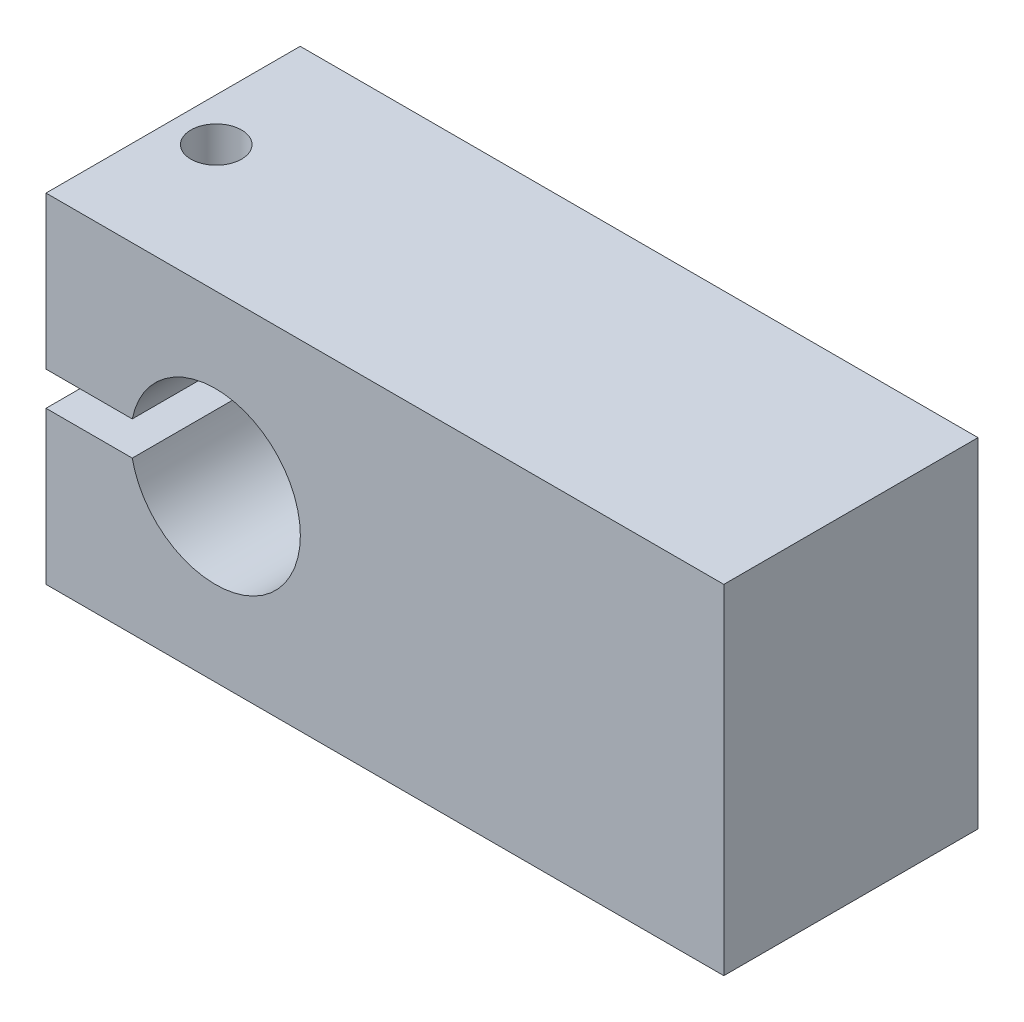
ISO-10303-21;
HEADER;
FILE_DESCRIPTION(('STEP AP214'),'2;1');
FILE_NAME('part.step','',(''),(''),'','','');
FILE_SCHEMA(('AUTOMOTIVE_DESIGN { 1 0 10303 214 1 1 1 1 }'));
ENDSEC;
DATA;
#1=APPLICATION_CONTEXT('core data for automotive mechanical design processes');
#2=APPLICATION_PROTOCOL_DEFINITION('international standard','automotive_design',2000,#1);
#3=PRODUCT_CONTEXT('',#1,'mechanical');
#4=PRODUCT('Part','Part','',(#3));
#5=PRODUCT_RELATED_PRODUCT_CATEGORY('part','',(#4));
#6=PRODUCT_DEFINITION_FORMATION('','',#4);
#7=PRODUCT_DEFINITION_CONTEXT('part definition',#1,'design');
#8=PRODUCT_DEFINITION('design','',#6,#7);
#9=PRODUCT_DEFINITION_SHAPE('','',#8);
#10=(LENGTH_UNIT() NAMED_UNIT(*) SI_UNIT(.MILLI.,.METRE.));
#11=(NAMED_UNIT(*) PLANE_ANGLE_UNIT() SI_UNIT($,.RADIAN.));
#12=(NAMED_UNIT(*) SI_UNIT($,.STERADIAN.) SOLID_ANGLE_UNIT());
#13=UNCERTAINTY_MEASURE_WITH_UNIT(LENGTH_MEASURE(1.E-05),#10,'distance_accuracy_value','');
#14=(GEOMETRIC_REPRESENTATION_CONTEXT(3) GLOBAL_UNCERTAINTY_ASSIGNED_CONTEXT((#13)) GLOBAL_UNIT_ASSIGNED_CONTEXT((#10,
#11,#12)) REPRESENTATION_CONTEXT('',''));
#15=CARTESIAN_POINT('',(0.,0.,0.));
#16=DIRECTION('',(0.,0.,1.));
#17=DIRECTION('',(1.,0.,0.));
#18=AXIS2_PLACEMENT_3D('',#15,#16,#17);
#19=CARTESIAN_POINT('',(0.,0.,19.05));
#20=DIRECTION('',(1.,0.,0.));
#21=DIRECTION('',(0.,0.,-1.));
#22=AXIS2_PLACEMENT_3D('',#19,#20,#21);
#23=PLANE('',#22);
#24=DIRECTION('',(0.,0.,1.));
#25=VECTOR('',#24,1.);
#26=CARTESIAN_POINT('',(0.,11.43,0.));
#27=LINE('',#26,#25);
#28=CARTESIAN_POINT('',(0.,11.43,0.));
#29=VERTEX_POINT('',#28);
#30=CARTESIAN_POINT('',(0.,11.43,19.05));
#31=VERTEX_POINT('',#30);
#32=EDGE_CURVE('E147',#29,#31,#27,.T.);
#33=ORIENTED_EDGE('',*,*,#32,.F.);
#34=DIRECTION('',(0.,-1.,0.));
#35=VECTOR('',#34,1.);
#36=CARTESIAN_POINT('',(0.,0.,0.));
#37=LINE('',#36,#35);
#38=CARTESIAN_POINT('',(0.,0.,0.));
#39=VERTEX_POINT('',#38);
#40=EDGE_CURVE('E146',#29,#39,#37,.T.);
#41=ORIENTED_EDGE('',*,*,#40,.T.);
#42=DIRECTION('',(0.,0.,-1.));
#43=VECTOR('',#42,1.);
#44=CARTESIAN_POINT('',(0.,0.,19.05));
#45=LINE('',#44,#43);
#46=CARTESIAN_POINT('',(0.,0.,19.05));
#47=VERTEX_POINT('',#46);
#48=EDGE_CURVE('E11',#47,#39,#45,.T.);
#49=ORIENTED_EDGE('',*,*,#48,.F.);
#50=DIRECTION('',(0.,-1.,0.));
#51=VECTOR('',#50,1.);
#52=CARTESIAN_POINT('',(0.,0.,19.05));
#53=LINE('',#52,#51);
#54=EDGE_CURVE('E91',#31,#47,#53,.T.);
#55=ORIENTED_EDGE('',*,*,#54,.F.);
#56=EDGE_LOOP('',(#33,#41,#49,#55));
#57=FACE_BOUND('',#56,.T.);
#58=ADVANCED_FACE('F39',(#57),#23,.F.);
#59=CARTESIAN_POINT('',(0.,0.,19.05));
#60=DIRECTION('',(0.,0.,-1.));
#61=DIRECTION('',(-1.,0.,0.));
#62=AXIS2_PLACEMENT_3D('',#59,#60,#61);
#63=PLANE('',#62);
#64=DIRECTION('',(-1.,0.,0.));
#65=VECTOR('',#64,1.);
#66=CARTESIAN_POINT('',(0.,11.43,19.05));
#67=LINE('',#66,#65);
#68=CARTESIAN_POINT('',(6.46533470906417,11.43,19.05));
#69=VERTEX_POINT('',#68);
#70=EDGE_CURVE('E133',#69,#31,#67,.T.);
#71=ORIENTED_EDGE('',*,*,#70,.T.);
#72=ORIENTED_EDGE('',*,*,#54,.T.);
#73=DIRECTION('',(1.,0.,0.));
#74=VECTOR('',#73,1.);
#75=CARTESIAN_POINT('',(0.,0.,19.05));
#76=LINE('',#75,#74);
#77=CARTESIAN_POINT('',(50.8,0.,19.05));
#78=VERTEX_POINT('',#77);
#79=EDGE_CURVE('E152',#47,#78,#76,.T.);
#80=ORIENTED_EDGE('',*,*,#79,.T.);
#81=DIRECTION('',(0.,1.,0.));
#82=VECTOR('',#81,1.);
#83=CARTESIAN_POINT('',(50.8,0.,19.05));
#84=LINE('',#83,#82);
#85=CARTESIAN_POINT('',(50.8,25.4,19.05));
#86=VERTEX_POINT('',#85);
#87=EDGE_CURVE('E154',#78,#86,#84,.T.);
#88=ORIENTED_EDGE('',*,*,#87,.T.);
#89=DIRECTION('',(-1.,0.,0.));
#90=VECTOR('',#89,1.);
#91=CARTESIAN_POINT('',(0.,25.4,19.05));
#92=LINE('',#91,#90);
#93=CARTESIAN_POINT('',(0.,25.4,19.05));
#94=VERTEX_POINT('',#93);
#95=EDGE_CURVE('E63',#86,#94,#92,.T.);
#96=ORIENTED_EDGE('',*,*,#95,.T.);
#97=CARTESIAN_POINT('',(0.,13.97,19.05));
#98=VERTEX_POINT('',#97);
#99=EDGE_CURVE('E150',#94,#98,#53,.T.);
#100=ORIENTED_EDGE('',*,*,#99,.T.);
#101=DIRECTION('',(-1.,0.,0.));
#102=VECTOR('',#101,1.);
#103=CARTESIAN_POINT('',(0.,13.97,19.05));
#104=LINE('',#103,#102);
#105=CARTESIAN_POINT('',(6.46533470906417,13.97,19.05));
#106=VERTEX_POINT('',#105);
#107=EDGE_CURVE('E135',#106,#98,#104,.T.);
#108=ORIENTED_EDGE('',*,*,#107,.F.);
#109=CARTESIAN_POINT('',(12.7,12.7,19.05));
#110=DIRECTION('',(0.,0.,1.));
#111=DIRECTION('',(1.,0.,0.));
#112=AXIS2_PLACEMENT_3D('',#109,#110,#111);
#113=CIRCLE('',#112,6.3627);
#114=EDGE_CURVE('E121',#69,#106,#113,.T.);
#115=ORIENTED_EDGE('',*,*,#114,.F.);
#116=EDGE_LOOP('',(#71,#72,#80,#88,#96,#100,#108,#115));
#117=FACE_BOUND('',#116,.T.);
#118=ADVANCED_FACE('F193',(#117),#63,.F.);
#119=CARTESIAN_POINT('',(0.,0.,0.));
#120=DIRECTION('',(0.,0.,-1.));
#121=DIRECTION('',(-1.,0.,0.));
#122=AXIS2_PLACEMENT_3D('',#119,#120,#121);
#123=PLANE('',#122);
#124=ORIENTED_EDGE('',*,*,#40,.F.);
#125=DIRECTION('',(-1.,0.,0.));
#126=VECTOR('',#125,1.);
#127=CARTESIAN_POINT('',(0.,11.43,0.));
#128=LINE('',#127,#126);
#129=CARTESIAN_POINT('',(6.46533470906417,11.43,0.));
#130=VERTEX_POINT('',#129);
#131=EDGE_CURVE('E123',#130,#29,#128,.T.);
#132=ORIENTED_EDGE('',*,*,#131,.F.);
#133=CARTESIAN_POINT('',(12.7,12.7,0.));
#134=DIRECTION('',(0.,0.,1.));
#135=DIRECTION('',(1.,0.,0.));
#136=AXIS2_PLACEMENT_3D('',#133,#134,#135);
#137=CIRCLE('',#136,6.3627);
#138=CARTESIAN_POINT('',(6.46533470906417,13.97,0.));
#139=VERTEX_POINT('',#138);
#140=EDGE_CURVE('E118',#130,#139,#137,.T.);
#141=ORIENTED_EDGE('',*,*,#140,.T.);
#142=DIRECTION('',(-1.,0.,0.));
#143=VECTOR('',#142,1.);
#144=CARTESIAN_POINT('',(0.,13.97,0.));
#145=LINE('',#144,#143);
#146=CARTESIAN_POINT('',(0.,13.97,0.));
#147=VERTEX_POINT('',#146);
#148=EDGE_CURVE('E125',#139,#147,#145,.T.);
#149=ORIENTED_EDGE('',*,*,#148,.T.);
#150=CARTESIAN_POINT('',(0.,25.4,0.));
#151=VERTEX_POINT('',#150);
#152=EDGE_CURVE('E158',#151,#147,#37,.T.);
#153=ORIENTED_EDGE('',*,*,#152,.F.);
#154=DIRECTION('',(-1.,0.,0.));
#155=VECTOR('',#154,1.);
#156=CARTESIAN_POINT('',(0.,25.4,0.));
#157=LINE('',#156,#155);
#158=CARTESIAN_POINT('',(50.8,25.4,0.));
#159=VERTEX_POINT('',#158);
#160=EDGE_CURVE('E84',#159,#151,#157,.T.);
#161=ORIENTED_EDGE('',*,*,#160,.F.);
#162=DIRECTION('',(0.,1.,0.));
#163=VECTOR('',#162,1.);
#164=CARTESIAN_POINT('',(50.8,0.,0.));
#165=LINE('',#164,#163);
#166=CARTESIAN_POINT('',(50.8,0.,0.));
#167=VERTEX_POINT('',#166);
#168=EDGE_CURVE('E162',#167,#159,#165,.T.);
#169=ORIENTED_EDGE('',*,*,#168,.F.);
#170=DIRECTION('',(1.,0.,0.));
#171=VECTOR('',#170,1.);
#172=CARTESIAN_POINT('',(0.,0.,0.));
#173=LINE('',#172,#171);
#174=EDGE_CURVE('E160',#39,#167,#173,.T.);
#175=ORIENTED_EDGE('',*,*,#174,.F.);
#176=EDGE_LOOP('',(#124,#132,#141,#149,#153,#161,#169,#175));
#177=FACE_BOUND('',#176,.T.);
#178=ADVANCED_FACE('F132',(#177),#123,.T.);
#179=ORIENTED_EDGE('',*,*,#152,.T.);
#180=DIRECTION('',(0.,0.,1.));
#181=VECTOR('',#180,1.);
#182=CARTESIAN_POINT('',(0.,13.97,0.));
#183=LINE('',#182,#181);
#184=EDGE_CURVE('E54',#147,#98,#183,.T.);
#185=ORIENTED_EDGE('',*,*,#184,.T.);
#186=ORIENTED_EDGE('',*,*,#99,.F.);
#187=DIRECTION('',(0.,0.,-1.));
#188=VECTOR('',#187,1.);
#189=CARTESIAN_POINT('',(0.,25.4,19.05));
#190=LINE('',#189,#188);
#191=EDGE_CURVE('E157',#94,#151,#190,.T.);
#192=ORIENTED_EDGE('',*,*,#191,.T.);
#193=EDGE_LOOP('',(#179,#185,#186,#192));
#194=FACE_BOUND('',#193,.T.);
#195=ADVANCED_FACE('F41',(#194),#23,.F.);
#196=CARTESIAN_POINT('',(0.,0.,19.05));
#197=DIRECTION('',(0.,1.,0.));
#198=DIRECTION('',(0.,0.,1.));
#199=AXIS2_PLACEMENT_3D('',#196,#197,#198);
#200=PLANE('',#199);
#201=CARTESIAN_POINT('',(3.23266735453208,0.,9.525));
#202=DIRECTION('',(0.,1.,0.));
#203=DIRECTION('',(0.,0.,1.));
#204=AXIS2_PLACEMENT_3D('',#201,#202,#203);
#205=CIRCLE('',#204,1.35255);
#206=CARTESIAN_POINT('',(3.23266735453208,0.,10.87755));
#207=VERTEX_POINT('',#206);
#208=EDGE_CURVE('E227',#207,#207,#205,.T.);
#209=ORIENTED_EDGE('',*,*,#208,.T.);
#210=EDGE_LOOP('',(#209));
#211=FACE_BOUND('',#210,.T.);
#212=ORIENTED_EDGE('',*,*,#174,.T.);
#213=DIRECTION('',(0.,0.,-1.));
#214=VECTOR('',#213,1.);
#215=CARTESIAN_POINT('',(50.8,0.,19.05));
#216=LINE('',#215,#214);
#217=EDGE_CURVE('E47',#78,#167,#216,.T.);
#218=ORIENTED_EDGE('',*,*,#217,.F.);
#219=ORIENTED_EDGE('',*,*,#79,.F.);
#220=ORIENTED_EDGE('',*,*,#48,.T.);
#221=EDGE_LOOP('',(#212,#218,#219,#220));
#222=FACE_BOUND('',#221,.T.);
#223=ADVANCED_FACE('F188',(#211,#222),#200,.F.);
#224=CARTESIAN_POINT('',(50.8,0.,19.05));
#225=DIRECTION('',(-1.,0.,0.));
#226=DIRECTION('',(0.,0.,1.));
#227=AXIS2_PLACEMENT_3D('',#224,#225,#226);
#228=PLANE('',#227);
#229=ORIENTED_EDGE('',*,*,#168,.T.);
#230=DIRECTION('',(0.,0.,-1.));
#231=VECTOR('',#230,1.);
#232=CARTESIAN_POINT('',(50.8,25.4,19.05));
#233=LINE('',#232,#231);
#234=EDGE_CURVE('E166',#86,#159,#233,.T.);
#235=ORIENTED_EDGE('',*,*,#234,.F.);
#236=ORIENTED_EDGE('',*,*,#87,.F.);
#237=ORIENTED_EDGE('',*,*,#217,.T.);
#238=EDGE_LOOP('',(#229,#235,#236,#237));
#239=FACE_BOUND('',#238,.T.);
#240=ADVANCED_FACE('F172',(#239),#228,.F.);
#241=CARTESIAN_POINT('',(0.,25.4,19.05));
#242=DIRECTION('',(0.,-1.,0.));
#243=DIRECTION('',(0.,0.,-1.));
#244=AXIS2_PLACEMENT_3D('',#241,#242,#243);
#245=PLANE('',#244);
#246=CARTESIAN_POINT('',(3.23266735453208,25.4,9.525));
#247=DIRECTION('',(0.,1.,0.));
#248=DIRECTION('',(0.,0.,1.));
#249=AXIS2_PLACEMENT_3D('',#246,#247,#248);
#250=CIRCLE('',#249,1.89865);
#251=CARTESIAN_POINT('',(3.23266735453208,25.4,11.42365));
#252=VERTEX_POINT('',#251);
#253=EDGE_CURVE('E232',#252,#252,#250,.T.);
#254=ORIENTED_EDGE('',*,*,#253,.F.);
#255=EDGE_LOOP('',(#254));
#256=FACE_BOUND('',#255,.T.);
#257=ORIENTED_EDGE('',*,*,#160,.T.);
#258=ORIENTED_EDGE('',*,*,#191,.F.);
#259=ORIENTED_EDGE('',*,*,#95,.F.);
#260=ORIENTED_EDGE('',*,*,#234,.T.);
#261=EDGE_LOOP('',(#257,#258,#259,#260));
#262=FACE_BOUND('',#261,.T.);
#263=ADVANCED_FACE('F178',(#256,#262),#245,.F.);
#264=CARTESIAN_POINT('',(12.7,12.7,0.));
#265=DIRECTION('',(0.,0.,1.));
#266=DIRECTION('',(1.,0.,0.));
#267=AXIS2_PLACEMENT_3D('',#264,#265,#266);
#268=CYLINDRICAL_SURFACE('',#267,6.3627);
#269=ORIENTED_EDGE('',*,*,#114,.T.);
#270=DIRECTION('',(0.,0.,1.));
#271=VECTOR('',#270,1.);
#272=CARTESIAN_POINT('',(6.46533470906417,13.97,0.));
#273=LINE('',#272,#271);
#274=EDGE_CURVE('E115',#139,#106,#273,.T.);
#275=ORIENTED_EDGE('',*,*,#274,.F.);
#276=ORIENTED_EDGE('',*,*,#140,.F.);
#277=DIRECTION('',(0.,0.,1.));
#278=VECTOR('',#277,1.);
#279=CARTESIAN_POINT('',(6.46533470906417,11.43,0.));
#280=LINE('',#279,#278);
#281=EDGE_CURVE('E144',#130,#69,#280,.T.);
#282=ORIENTED_EDGE('',*,*,#281,.T.);
#283=EDGE_LOOP('',(#269,#275,#276,#282));
#284=FACE_BOUND('',#283,.T.);
#285=ADVANCED_FACE('F116',(#284),#268,.F.);
#286=CARTESIAN_POINT('',(0.,11.43,0.));
#287=DIRECTION('',(0.,1.,0.));
#288=DIRECTION('',(-1.,0.,0.));
#289=AXIS2_PLACEMENT_3D('',#286,#287,#288);
#290=PLANE('',#289);
#291=CARTESIAN_POINT('',(3.23266735453208,11.43,9.525));
#292=DIRECTION('',(0.,1.,0.));
#293=DIRECTION('',(0.,0.,1.));
#294=AXIS2_PLACEMENT_3D('',#291,#292,#293);
#295=CIRCLE('',#294,1.35255);
#296=CARTESIAN_POINT('',(3.23266735453208,11.43,10.87755));
#297=VERTEX_POINT('',#296);
#298=EDGE_CURVE('E230',#297,#297,#295,.T.);
#299=ORIENTED_EDGE('',*,*,#298,.F.);
#300=EDGE_LOOP('',(#299));
#301=FACE_BOUND('',#300,.T.);
#302=ORIENTED_EDGE('',*,*,#70,.F.);
#303=ORIENTED_EDGE('',*,*,#281,.F.);
#304=ORIENTED_EDGE('',*,*,#131,.T.);
#305=ORIENTED_EDGE('',*,*,#32,.T.);
#306=EDGE_LOOP('',(#302,#303,#304,#305));
#307=FACE_BOUND('',#306,.T.);
#308=ADVANCED_FACE('F186',(#301,#307),#290,.T.);
#309=CARTESIAN_POINT('',(0.,13.97,0.));
#310=DIRECTION('',(0.,1.,0.));
#311=DIRECTION('',(-1.,0.,0.));
#312=AXIS2_PLACEMENT_3D('',#309,#310,#311);
#313=PLANE('',#312);
#314=CARTESIAN_POINT('',(3.23266735453208,13.97,9.525));
#315=DIRECTION('',(0.,1.,0.));
#316=DIRECTION('',(-1.,0.,0.));
#317=AXIS2_PLACEMENT_3D('',#314,#315,#316);
#318=CIRCLE('',#317,1.89865);
#319=CARTESIAN_POINT('',(1.33401735453209,13.97,9.525));
#320=VERTEX_POINT('',#319);
#321=EDGE_CURVE('E138',#320,#320,#318,.T.);
#322=ORIENTED_EDGE('',*,*,#321,.T.);
#323=EDGE_LOOP('',(#322));
#324=FACE_BOUND('',#323,.T.);
#325=ORIENTED_EDGE('',*,*,#107,.T.);
#326=ORIENTED_EDGE('',*,*,#184,.F.);
#327=ORIENTED_EDGE('',*,*,#148,.F.);
#328=ORIENTED_EDGE('',*,*,#274,.T.);
#329=EDGE_LOOP('',(#325,#326,#327,#328));
#330=FACE_BOUND('',#329,.T.);
#331=ADVANCED_FACE('F126',(#324,#330),#313,.F.);
#332=CARTESIAN_POINT('',(3.23266735453208,25.4,9.525));
#333=DIRECTION('',(0.,1.,0.));
#334=DIRECTION('',(0.,0.,1.));
#335=AXIS2_PLACEMENT_3D('',#332,#333,#334);
#336=CYLINDRICAL_SURFACE('',#335,1.89865);
#337=ORIENTED_EDGE('',*,*,#321,.F.);
#338=EDGE_LOOP('',(#337));
#339=FACE_BOUND('',#338,.T.);
#340=ORIENTED_EDGE('',*,*,#253,.T.);
#341=EDGE_LOOP('',(#340));
#342=FACE_BOUND('',#341,.T.);
#343=ADVANCED_FACE('F211',(#339,#342),#336,.F.);
#344=CARTESIAN_POINT('',(3.23266735453208,11.43,9.525));
#345=DIRECTION('',(0.,1.,0.));
#346=DIRECTION('',(0.,0.,1.));
#347=AXIS2_PLACEMENT_3D('',#344,#345,#346);
#348=CYLINDRICAL_SURFACE('',#347,1.35255);
#349=ORIENTED_EDGE('',*,*,#208,.F.);
#350=EDGE_LOOP('',(#349));
#351=FACE_BOUND('',#350,.T.);
#352=ORIENTED_EDGE('',*,*,#298,.T.);
#353=EDGE_LOOP('',(#352));
#354=FACE_BOUND('',#353,.T.);
#355=ADVANCED_FACE('F218',(#351,#354),#348,.F.);
#356=CLOSED_SHELL('',(#58,#118,#178,#195,#223,#240,#263,#285,#308,#331,#343,#355));
#357=MANIFOLD_SOLID_BREP('B2',#356);
#358=ADVANCED_BREP_SHAPE_REPRESENTATION('',(#18,#357),#14);
#359=SHAPE_DEFINITION_REPRESENTATION(#9,#358);
ENDSEC;
END-ISO-10303-21;
